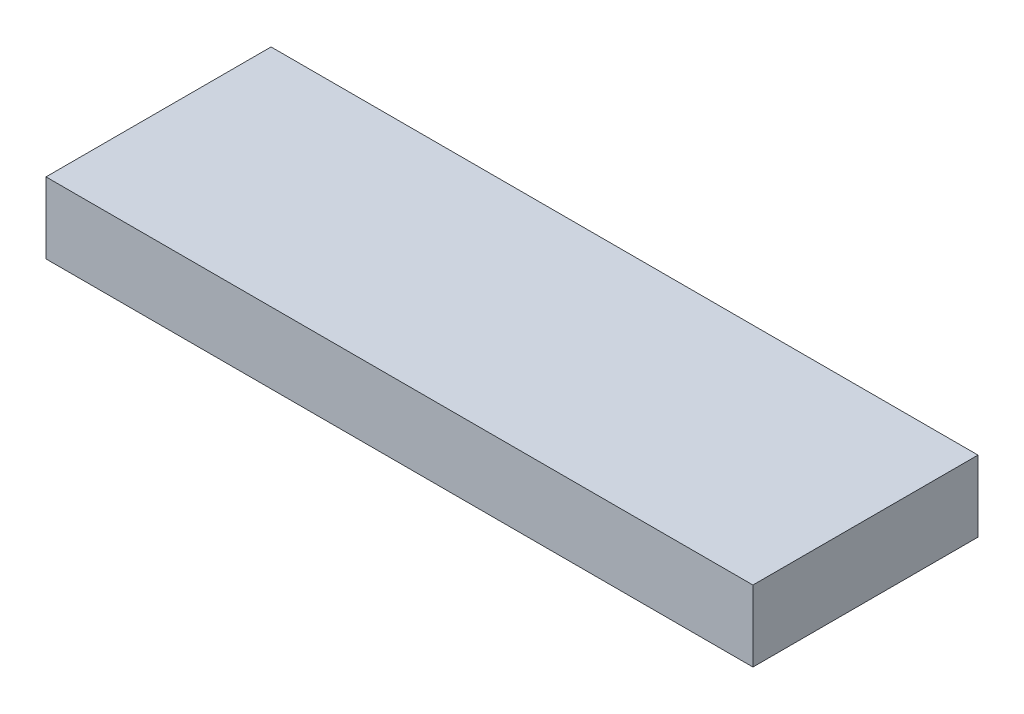
ISO-10303-21;
HEADER;
FILE_DESCRIPTION(('STEP AP214'),'2;1');
FILE_NAME('part.step','',(''),(''),'','','');
FILE_SCHEMA(('AUTOMOTIVE_DESIGN { 1 0 10303 214 1 1 1 1 }'));
ENDSEC;
DATA;
#1=APPLICATION_CONTEXT('core data for automotive mechanical design processes');
#2=APPLICATION_PROTOCOL_DEFINITION('international standard','automotive_design',2000,#1);
#3=PRODUCT_CONTEXT('',#1,'mechanical');
#4=PRODUCT('Part','Part','',(#3));
#5=PRODUCT_RELATED_PRODUCT_CATEGORY('part','',(#4));
#6=PRODUCT_DEFINITION_FORMATION('','',#4);
#7=PRODUCT_DEFINITION_CONTEXT('part definition',#1,'design');
#8=PRODUCT_DEFINITION('design','',#6,#7);
#9=PRODUCT_DEFINITION_SHAPE('','',#8);
#10=(LENGTH_UNIT() NAMED_UNIT(*) SI_UNIT(.MILLI.,.METRE.));
#11=(NAMED_UNIT(*) PLANE_ANGLE_UNIT() SI_UNIT($,.RADIAN.));
#12=(NAMED_UNIT(*) SI_UNIT($,.STERADIAN.) SOLID_ANGLE_UNIT());
#13=UNCERTAINTY_MEASURE_WITH_UNIT(LENGTH_MEASURE(1.E-05),#10,'distance_accuracy_value','');
#14=(GEOMETRIC_REPRESENTATION_CONTEXT(3) GLOBAL_UNCERTAINTY_ASSIGNED_CONTEXT((#13)) GLOBAL_UNIT_ASSIGNED_CONTEXT((#10,
#11,#12)) REPRESENTATION_CONTEXT('',''));
#15=CARTESIAN_POINT('',(0.,0.,0.));
#16=DIRECTION('',(0.,0.,1.));
#17=DIRECTION('',(1.,0.,0.));
#18=AXIS2_PLACEMENT_3D('',#15,#16,#17);
#19=CARTESIAN_POINT('',(0.,0.,0.));
#20=DIRECTION('',(0.,0.,1.));
#21=DIRECTION('',(1.,0.,0.));
#22=AXIS2_PLACEMENT_3D('',#19,#20,#21);
#23=PLANE('',#22);
#24=DIRECTION('',(0.,-1.,0.));
#25=VECTOR('',#24,1.);
#26=CARTESIAN_POINT('',(133.861233663559,0.,0.));
#27=LINE('',#26,#25);
#28=CARTESIAN_POINT('',(133.861233663559,0.,0.));
#29=VERTEX_POINT('',#28);
#30=CARTESIAN_POINT('',(133.861233663559,-19.05,0.));
#31=VERTEX_POINT('',#30);
#32=EDGE_CURVE('E85',#29,#31,#27,.T.);
#33=ORIENTED_EDGE('',*,*,#32,.F.);
#34=DIRECTION('',(-1.,0.,0.));
#35=VECTOR('',#34,1.);
#36=CARTESIAN_POINT('',(133.861233663559,0.,0.));
#37=LINE('',#36,#35);
#38=CARTESIAN_POINT('',(323.338766336441,0.,0.));
#39=VERTEX_POINT('',#38);
#40=EDGE_CURVE('E96',#39,#29,#37,.T.);
#41=ORIENTED_EDGE('',*,*,#40,.F.);
#42=DIRECTION('',(0.,1.,0.));
#43=VECTOR('',#42,1.);
#44=CARTESIAN_POINT('',(323.338766336441,0.,0.));
#45=LINE('',#44,#43);
#46=CARTESIAN_POINT('',(323.338766336441,-19.05,0.));
#47=VERTEX_POINT('',#46);
#48=EDGE_CURVE('E87',#47,#39,#45,.T.);
#49=ORIENTED_EDGE('',*,*,#48,.F.);
#50=DIRECTION('',(1.,0.,0.));
#51=VECTOR('',#50,1.);
#52=CARTESIAN_POINT('',(133.861233663559,-19.05,0.));
#53=LINE('',#52,#51);
#54=EDGE_CURVE('E77',#31,#47,#53,.T.);
#55=ORIENTED_EDGE('',*,*,#54,.F.);
#56=EDGE_LOOP('',(#33,#41,#49,#55));
#57=FACE_BOUND('',#56,.T.);
#58=ADVANCED_FACE('F35',(#57),#23,.F.);
#59=CARTESIAN_POINT('',(133.861233663559,0.,250.757764743368));
#60=DIRECTION('',(0.,-1.,0.));
#61=DIRECTION('',(0.,0.,-1.));
#62=AXIS2_PLACEMENT_3D('',#59,#60,#61);
#63=PLANE('',#62);
#64=DIRECTION('',(0.,0.,-1.));
#65=VECTOR('',#64,1.);
#66=CARTESIAN_POINT('',(133.861233663559,0.,250.757764743368));
#67=LINE('',#66,#65);
#68=CARTESIAN_POINT('',(133.861233663559,0.,60.325));
#69=VERTEX_POINT('',#68);
#70=EDGE_CURVE('E90',#69,#29,#67,.T.);
#71=ORIENTED_EDGE('',*,*,#70,.F.);
#72=DIRECTION('',(1.,0.,0.));
#73=VECTOR('',#72,1.);
#74=CARTESIAN_POINT('',(133.861233663559,0.,60.325));
#75=LINE('',#74,#73);
#76=CARTESIAN_POINT('',(323.338766336441,0.,60.325));
#77=VERTEX_POINT('',#76);
#78=EDGE_CURVE('E39',#69,#77,#75,.T.);
#79=ORIENTED_EDGE('',*,*,#78,.T.);
#80=DIRECTION('',(0.,0.,-1.));
#81=VECTOR('',#80,1.);
#82=CARTESIAN_POINT('',(323.338766336441,0.,250.757764743368));
#83=LINE('',#82,#81);
#84=EDGE_CURVE('E99',#77,#39,#83,.T.);
#85=ORIENTED_EDGE('',*,*,#84,.T.);
#86=ORIENTED_EDGE('',*,*,#40,.T.);
#87=EDGE_LOOP('',(#71,#79,#85,#86));
#88=FACE_BOUND('',#87,.T.);
#89=ADVANCED_FACE('F108',(#88),#63,.F.);
#90=CARTESIAN_POINT('',(323.338766336441,0.,250.757764743368));
#91=DIRECTION('',(-1.,0.,0.));
#92=DIRECTION('',(0.,0.,1.));
#93=AXIS2_PLACEMENT_3D('',#90,#91,#92);
#94=PLANE('',#93);
#95=ORIENTED_EDGE('',*,*,#84,.F.);
#96=DIRECTION('',(0.,-1.,0.));
#97=VECTOR('',#96,1.);
#98=CARTESIAN_POINT('',(323.338766336441,0.,60.325));
#99=LINE('',#98,#97);
#100=CARTESIAN_POINT('',(323.338766336441,-19.05,60.325));
#101=VERTEX_POINT('',#100);
#102=EDGE_CURVE('E105',#77,#101,#99,.T.);
#103=ORIENTED_EDGE('',*,*,#102,.T.);
#104=DIRECTION('',(0.,0.,-1.));
#105=VECTOR('',#104,1.);
#106=CARTESIAN_POINT('',(323.338766336441,-19.05,250.757764743368));
#107=LINE('',#106,#105);
#108=EDGE_CURVE('E81',#101,#47,#107,.T.);
#109=ORIENTED_EDGE('',*,*,#108,.T.);
#110=ORIENTED_EDGE('',*,*,#48,.T.);
#111=EDGE_LOOP('',(#95,#103,#109,#110));
#112=FACE_BOUND('',#111,.T.);
#113=ADVANCED_FACE('F104',(#112),#94,.F.);
#114=CARTESIAN_POINT('',(133.861233663559,-19.05,250.757764743368));
#115=DIRECTION('',(0.,1.,0.));
#116=DIRECTION('',(-1.,0.,0.));
#117=AXIS2_PLACEMENT_3D('',#114,#115,#116);
#118=PLANE('',#117);
#119=ORIENTED_EDGE('',*,*,#108,.F.);
#120=DIRECTION('',(-1.,0.,0.));
#121=VECTOR('',#120,1.);
#122=CARTESIAN_POINT('',(133.861233663559,-19.05,60.325));
#123=LINE('',#122,#121);
#124=CARTESIAN_POINT('',(133.861233663559,-19.05,60.325));
#125=VERTEX_POINT('',#124);
#126=EDGE_CURVE('E44',#101,#125,#123,.T.);
#127=ORIENTED_EDGE('',*,*,#126,.T.);
#128=DIRECTION('',(0.,0.,-1.));
#129=VECTOR('',#128,1.);
#130=CARTESIAN_POINT('',(133.861233663559,-19.05,250.757764743368));
#131=LINE('',#130,#129);
#132=EDGE_CURVE('E74',#125,#31,#131,.T.);
#133=ORIENTED_EDGE('',*,*,#132,.T.);
#134=ORIENTED_EDGE('',*,*,#54,.T.);
#135=EDGE_LOOP('',(#119,#127,#133,#134));
#136=FACE_BOUND('',#135,.T.);
#137=ADVANCED_FACE('F76',(#136),#118,.F.);
#138=CARTESIAN_POINT('',(133.861233663559,0.,250.757764743368));
#139=DIRECTION('',(1.,0.,0.));
#140=DIRECTION('',(0.,0.,-1.));
#141=AXIS2_PLACEMENT_3D('',#138,#139,#140);
#142=PLANE('',#141);
#143=ORIENTED_EDGE('',*,*,#132,.F.);
#144=DIRECTION('',(0.,1.,0.));
#145=VECTOR('',#144,1.);
#146=CARTESIAN_POINT('',(133.861233663559,0.,60.325));
#147=LINE('',#146,#145);
#148=EDGE_CURVE('E11',#125,#69,#147,.T.);
#149=ORIENTED_EDGE('',*,*,#148,.T.);
#150=ORIENTED_EDGE('',*,*,#70,.T.);
#151=ORIENTED_EDGE('',*,*,#32,.T.);
#152=EDGE_LOOP('',(#143,#149,#150,#151));
#153=FACE_BOUND('',#152,.T.);
#154=ADVANCED_FACE('F37',(#153),#142,.F.);
#155=CARTESIAN_POINT('',(-209.037766336441,1.77870250412711E-12,60.325));
#156=DIRECTION('',(0.,0.,-1.));
#157=DIRECTION('',(0.,1.,0.));
#158=AXIS2_PLACEMENT_3D('',#155,#156,#157);
#159=PLANE('',#158);
#160=ORIENTED_EDGE('',*,*,#126,.F.);
#161=ORIENTED_EDGE('',*,*,#102,.F.);
#162=ORIENTED_EDGE('',*,*,#78,.F.);
#163=ORIENTED_EDGE('',*,*,#148,.F.);
#164=EDGE_LOOP('',(#160,#161,#162,#163));
#165=FACE_BOUND('',#164,.T.);
#166=ADVANCED_FACE('F122',(#165),#159,.F.);
#167=CLOSED_SHELL('',(#58,#89,#113,#137,#154,#166));
#168=MANIFOLD_SOLID_BREP('B2',#167);
#169=ADVANCED_BREP_SHAPE_REPRESENTATION('',(#18,#168),#14);
#170=SHAPE_DEFINITION_REPRESENTATION(#9,#169);
ENDSEC;
END-ISO-10303-21;
